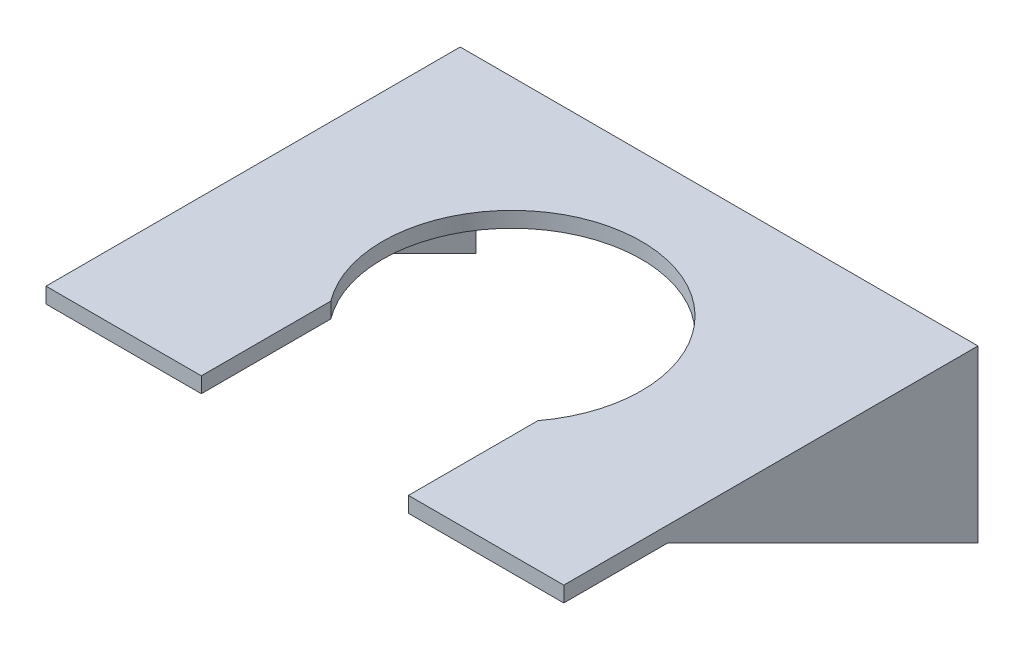
ISO-10303-21;
HEADER;
FILE_DESCRIPTION(('STEP AP214'),'2;1');
FILE_NAME('part.step','',(''),(''),'','','');
FILE_SCHEMA(('AUTOMOTIVE_DESIGN { 1 0 10303 214 1 1 1 1 }'));
ENDSEC;
DATA;
#1=APPLICATION_CONTEXT('core data for automotive mechanical design processes');
#2=APPLICATION_PROTOCOL_DEFINITION('international standard','automotive_design',2000,#1);
#3=PRODUCT_CONTEXT('',#1,'mechanical');
#4=PRODUCT('Part','Part','',(#3));
#5=PRODUCT_RELATED_PRODUCT_CATEGORY('part','',(#4));
#6=PRODUCT_DEFINITION_FORMATION('','',#4);
#7=PRODUCT_DEFINITION_CONTEXT('part definition',#1,'design');
#8=PRODUCT_DEFINITION('design','',#6,#7);
#9=PRODUCT_DEFINITION_SHAPE('','',#8);
#10=(LENGTH_UNIT() NAMED_UNIT(*) SI_UNIT(.MILLI.,.METRE.));
#11=(NAMED_UNIT(*) PLANE_ANGLE_UNIT() SI_UNIT($,.RADIAN.));
#12=(NAMED_UNIT(*) SI_UNIT($,.STERADIAN.) SOLID_ANGLE_UNIT());
#13=UNCERTAINTY_MEASURE_WITH_UNIT(LENGTH_MEASURE(1.E-05),#10,'distance_accuracy_value','');
#14=(GEOMETRIC_REPRESENTATION_CONTEXT(3) GLOBAL_UNCERTAINTY_ASSIGNED_CONTEXT((#13)) GLOBAL_UNIT_ASSIGNED_CONTEXT((#10,
#11,#12)) REPRESENTATION_CONTEXT('',''));
#15=CARTESIAN_POINT('',(0.,0.,0.));
#16=DIRECTION('',(0.,0.,1.));
#17=DIRECTION('',(1.,0.,0.));
#18=AXIS2_PLACEMENT_3D('',#15,#16,#17);
#19=CARTESIAN_POINT('',(-25.,-2.56176848089127,40.));
#20=DIRECTION('',(0.,1.,0.));
#21=DIRECTION('',(-1.,0.,0.));
#22=AXIS2_PLACEMENT_3D('',#19,#20,#21);
#23=PLANE('',#22);
#24=DIRECTION('',(1.,0.,0.));
#25=VECTOR('',#24,1.);
#26=CARTESIAN_POINT('',(23.5,-2.56176848089129,30.));
#27=LINE('',#26,#25);
#28=CARTESIAN_POINT('',(23.5,-2.56176848089126,30.));
#29=VERTEX_POINT('',#28);
#30=CARTESIAN_POINT('',(25.,-2.56176848089126,30.));
#31=VERTEX_POINT('',#30);
#32=EDGE_CURVE('E53',#29,#31,#27,.T.);
#33=ORIENTED_EDGE('',*,*,#32,.T.);
#34=DIRECTION('',(0.,0.,-1.));
#35=VECTOR('',#34,1.);
#36=CARTESIAN_POINT('',(25.,-2.56176848089126,40.));
#37=LINE('',#36,#35);
#38=CARTESIAN_POINT('',(25.,-2.56176848089126,40.));
#39=VERTEX_POINT('',#38);
#40=EDGE_CURVE('E41',#39,#31,#37,.T.);
#41=ORIENTED_EDGE('',*,*,#40,.F.);
#42=DIRECTION('',(1.,0.,0.));
#43=VECTOR('',#42,1.);
#44=CARTESIAN_POINT('',(-25.,-2.56176848089127,40.));
#45=LINE('',#44,#43);
#46=CARTESIAN_POINT('',(10.,-2.56176848089127,40.));
#47=VERTEX_POINT('',#46);
#48=EDGE_CURVE('E190',#47,#39,#45,.T.);
#49=ORIENTED_EDGE('',*,*,#48,.F.);
#50=DIRECTION('',(0.,0.,1.));
#51=VECTOR('',#50,1.);
#52=CARTESIAN_POINT('',(10.,-2.56176848089126,27.5));
#53=LINE('',#52,#51);
#54=CARTESIAN_POINT('',(10.,-2.56176848089126,27.5));
#55=VERTEX_POINT('',#54);
#56=EDGE_CURVE('E164',#55,#47,#53,.T.);
#57=ORIENTED_EDGE('',*,*,#56,.F.);
#58=CARTESIAN_POINT('',(0.,-2.56176848089126,20.));
#59=DIRECTION('',(0.,1.,0.));
#60=DIRECTION('',(-1.,0.,0.));
#61=AXIS2_PLACEMENT_3D('',#58,#59,#60);
#62=CIRCLE('',#61,12.5);
#63=CARTESIAN_POINT('',(-9.99999999999999,-2.56176848089127,27.5));
#64=VERTEX_POINT('',#63);
#65=EDGE_CURVE('E166',#64,#55,#62,.F.);
#66=ORIENTED_EDGE('',*,*,#65,.F.);
#67=DIRECTION('',(0.,0.,-1.));
#68=VECTOR('',#67,1.);
#69=CARTESIAN_POINT('',(-9.99999999999999,-2.56176848089127,27.5));
#70=LINE('',#69,#68);
#71=CARTESIAN_POINT('',(-9.99999999999999,-2.56176848089127,40.));
#72=VERTEX_POINT('',#71);
#73=EDGE_CURVE('E169',#72,#64,#70,.T.);
#74=ORIENTED_EDGE('',*,*,#73,.F.);
#75=CARTESIAN_POINT('',(-25.,-2.56176848089127,40.));
#76=VERTEX_POINT('',#75);
#77=EDGE_CURVE('E192',#76,#72,#45,.T.);
#78=ORIENTED_EDGE('',*,*,#77,.F.);
#79=DIRECTION('',(0.,0.,-1.));
#80=VECTOR('',#79,1.);
#81=CARTESIAN_POINT('',(-25.,-2.56176848089127,40.));
#82=LINE('',#81,#80);
#83=CARTESIAN_POINT('',(-25.,-2.56176848089129,30.));
#84=VERTEX_POINT('',#83);
#85=EDGE_CURVE('E11',#76,#84,#82,.T.);
#86=ORIENTED_EDGE('',*,*,#85,.T.);
#87=DIRECTION('',(-1.,0.,0.));
#88=VECTOR('',#87,1.);
#89=CARTESIAN_POINT('',(-23.5,-2.56176848089129,30.));
#90=LINE('',#89,#88);
#91=CARTESIAN_POINT('',(-23.5,-2.56176848089129,30.));
#92=VERTEX_POINT('',#91);
#93=EDGE_CURVE('E159',#92,#84,#90,.T.);
#94=ORIENTED_EDGE('',*,*,#93,.F.);
#95=DIRECTION('',(0.,0.,-1.));
#96=VECTOR('',#95,1.);
#97=CARTESIAN_POINT('',(-23.5,-2.56176848089129,30.));
#98=LINE('',#97,#96);
#99=CARTESIAN_POINT('',(-23.5,-2.56176848089127,0.));
#100=VERTEX_POINT('',#99);
#101=EDGE_CURVE('E147',#92,#100,#98,.T.);
#102=ORIENTED_EDGE('',*,*,#101,.T.);
#103=DIRECTION('',(1.,0.,0.));
#104=VECTOR('',#103,1.);
#105=CARTESIAN_POINT('',(-25.,-2.56176848089127,0.));
#106=LINE('',#105,#104);
#107=CARTESIAN_POINT('',(23.5,-2.56176848089126,0.));
#108=VERTEX_POINT('',#107);
#109=EDGE_CURVE('E203',#100,#108,#106,.T.);
#110=ORIENTED_EDGE('',*,*,#109,.T.);
#111=DIRECTION('',(0.,0.,-1.));
#112=VECTOR('',#111,1.);
#113=CARTESIAN_POINT('',(23.5,-2.56176848089129,30.));
#114=LINE('',#113,#112);
#115=EDGE_CURVE('E48',#29,#108,#114,.T.);
#116=ORIENTED_EDGE('',*,*,#115,.F.);
#117=EDGE_LOOP('',(#33,#41,#49,#57,#66,#74,#78,#86,#94,#102,#110,#116));
#118=FACE_BOUND('',#117,.T.);
#119=ADVANCED_FACE('F33',(#118),#23,.F.);
#120=CARTESIAN_POINT('',(0.,0.,40.));
#121=DIRECTION('',(0.,0.,1.));
#122=DIRECTION('',(1.,0.,0.));
#123=AXIS2_PLACEMENT_3D('',#120,#121,#122);
#124=PLANE('',#123);
#125=DIRECTION('',(0.,1.,0.));
#126=VECTOR('',#125,1.);
#127=CARTESIAN_POINT('',(10.,-43.5648171480331,40.));
#128=LINE('',#127,#126);
#129=CARTESIAN_POINT('',(10.,-1.06176848089127,40.));
#130=VERTEX_POINT('',#129);
#131=EDGE_CURVE('E179',#47,#130,#128,.T.);
#132=ORIENTED_EDGE('',*,*,#131,.F.);
#133=ORIENTED_EDGE('',*,*,#48,.T.);
#134=DIRECTION('',(0.,1.,0.));
#135=VECTOR('',#134,1.);
#136=CARTESIAN_POINT('',(25.,-1.06176848089126,40.));
#137=LINE('',#136,#135);
#138=CARTESIAN_POINT('',(25.,-1.06176848089126,40.));
#139=VERTEX_POINT('',#138);
#140=EDGE_CURVE('E195',#39,#139,#137,.T.);
#141=ORIENTED_EDGE('',*,*,#140,.T.);
#142=DIRECTION('',(-1.,0.,0.));
#143=VECTOR('',#142,1.);
#144=CARTESIAN_POINT('',(-25.,-1.06176848089127,40.));
#145=LINE('',#144,#143);
#146=EDGE_CURVE('E198',#139,#130,#145,.T.);
#147=ORIENTED_EDGE('',*,*,#146,.T.);
#148=EDGE_LOOP('',(#132,#133,#141,#147));
#149=FACE_BOUND('',#148,.T.);
#150=ADVANCED_FACE('F220',(#149),#124,.T.);
#151=CARTESIAN_POINT('',(-25.,-1.06176848089127,40.));
#152=DIRECTION('',(1.,0.,0.));
#153=DIRECTION('',(0.,0.,-1.));
#154=AXIS2_PLACEMENT_3D('',#151,#152,#153);
#155=PLANE('',#154);
#156=DIRECTION('',(0.,-1.,0.));
#157=VECTOR('',#156,1.);
#158=CARTESIAN_POINT('',(-25.,-1.06176848089127,0.));
#159=LINE('',#158,#157);
#160=CARTESIAN_POINT('',(-25.,-1.06176848089127,0.));
#161=VERTEX_POINT('',#160);
#162=CARTESIAN_POINT('',(-25.,-17.5617684808913,0.));
#163=VERTEX_POINT('',#162);
#164=EDGE_CURVE('E186',#161,#163,#159,.T.);
#165=ORIENTED_EDGE('',*,*,#164,.T.);
#166=DIRECTION('',(0.,0.447213595499958,0.894427190999916));
#167=VECTOR('',#166,1.);
#168=CARTESIAN_POINT('',(-25.,-17.5617684808913,0.));
#169=LINE('',#168,#167);
#170=EDGE_CURVE('E138',#163,#84,#169,.T.);
#171=ORIENTED_EDGE('',*,*,#170,.T.);
#172=ORIENTED_EDGE('',*,*,#85,.F.);
#173=DIRECTION('',(0.,-1.,0.));
#174=VECTOR('',#173,1.);
#175=CARTESIAN_POINT('',(-25.,-1.06176848089127,40.));
#176=LINE('',#175,#174);
#177=CARTESIAN_POINT('',(-25.,-1.06176848089127,40.));
#178=VERTEX_POINT('',#177);
#179=EDGE_CURVE('E187',#178,#76,#176,.T.);
#180=ORIENTED_EDGE('',*,*,#179,.F.);
#181=DIRECTION('',(0.,0.,-1.));
#182=VECTOR('',#181,1.);
#183=CARTESIAN_POINT('',(-25.,-1.06176848089127,40.));
#184=LINE('',#183,#182);
#185=EDGE_CURVE('E201',#178,#161,#184,.T.);
#186=ORIENTED_EDGE('',*,*,#185,.T.);
#187=EDGE_LOOP('',(#165,#171,#172,#180,#186));
#188=FACE_BOUND('',#187,.T.);
#189=ADVANCED_FACE('F35',(#188),#155,.F.);
#190=CARTESIAN_POINT('',(25.,-1.06176848089126,40.));
#191=DIRECTION('',(-1.,0.,0.));
#192=DIRECTION('',(0.,0.,1.));
#193=AXIS2_PLACEMENT_3D('',#190,#191,#192);
#194=PLANE('',#193);
#195=DIRECTION('',(0.,1.,0.));
#196=VECTOR('',#195,1.);
#197=CARTESIAN_POINT('',(25.,-1.06176848089126,0.));
#198=LINE('',#197,#196);
#199=CARTESIAN_POINT('',(25.,-17.5617684808913,0.));
#200=VERTEX_POINT('',#199);
#201=CARTESIAN_POINT('',(25.,-1.06176848089126,0.));
#202=VERTEX_POINT('',#201);
#203=EDGE_CURVE('E134',#200,#202,#198,.T.);
#204=ORIENTED_EDGE('',*,*,#203,.T.);
#205=DIRECTION('',(0.,0.,-1.));
#206=VECTOR('',#205,1.);
#207=CARTESIAN_POINT('',(25.,-1.06176848089126,40.));
#208=LINE('',#207,#206);
#209=EDGE_CURVE('E209',#139,#202,#208,.T.);
#210=ORIENTED_EDGE('',*,*,#209,.F.);
#211=ORIENTED_EDGE('',*,*,#140,.F.);
#212=ORIENTED_EDGE('',*,*,#40,.T.);
#213=DIRECTION('',(0.,0.447213595499958,0.894427190999916));
#214=VECTOR('',#213,1.);
#215=CARTESIAN_POINT('',(25.,-17.5617684808913,0.));
#216=LINE('',#215,#214);
#217=EDGE_CURVE('E142',#200,#31,#216,.T.);
#218=ORIENTED_EDGE('',*,*,#217,.F.);
#219=EDGE_LOOP('',(#204,#210,#211,#212,#218));
#220=FACE_BOUND('',#219,.T.);
#221=ADVANCED_FACE('F213',(#220),#194,.F.);
#222=CARTESIAN_POINT('',(-25.,-1.06176848089127,40.));
#223=DIRECTION('',(0.,-1.,0.));
#224=DIRECTION('',(1.,0.,0.));
#225=AXIS2_PLACEMENT_3D('',#222,#223,#224);
#226=PLANE('',#225);
#227=CARTESIAN_POINT('',(0.,-1.06176848089127,20.));
#228=DIRECTION('',(0.,1.,0.));
#229=DIRECTION('',(0.,0.,1.));
#230=AXIS2_PLACEMENT_3D('',#227,#228,#229);
#231=CIRCLE('',#230,12.5);
#232=CARTESIAN_POINT('',(10.,-1.06176848089127,27.5));
#233=VERTEX_POINT('',#232);
#234=CARTESIAN_POINT('',(-9.99999999999999,-1.06176848089127,27.5));
#235=VERTEX_POINT('',#234);
#236=EDGE_CURVE('E161',#233,#235,#231,.T.);
#237=ORIENTED_EDGE('',*,*,#236,.F.);
#238=DIRECTION('',(0.,0.,-1.));
#239=VECTOR('',#238,1.);
#240=CARTESIAN_POINT('',(10.,-1.06176848089127,27.5));
#241=LINE('',#240,#239);
#242=EDGE_CURVE('E174',#130,#233,#241,.T.);
#243=ORIENTED_EDGE('',*,*,#242,.F.);
#244=ORIENTED_EDGE('',*,*,#146,.F.);
#245=ORIENTED_EDGE('',*,*,#209,.T.);
#246=DIRECTION('',(-1.,0.,0.));
#247=VECTOR('',#246,1.);
#248=CARTESIAN_POINT('',(-25.,-1.06176848089127,0.));
#249=LINE('',#248,#247);
#250=EDGE_CURVE('E191',#202,#161,#249,.T.);
#251=ORIENTED_EDGE('',*,*,#250,.T.);
#252=ORIENTED_EDGE('',*,*,#185,.F.);
#253=CARTESIAN_POINT('',(-9.99999999999999,-1.06176848089127,40.));
#254=VERTEX_POINT('',#253);
#255=EDGE_CURVE('E197',#254,#178,#145,.T.);
#256=ORIENTED_EDGE('',*,*,#255,.F.);
#257=DIRECTION('',(0.,0.,1.));
#258=VECTOR('',#257,1.);
#259=CARTESIAN_POINT('',(-9.99999999999999,-1.06176848089127,27.5));
#260=LINE('',#259,#258);
#261=EDGE_CURVE('E172',#235,#254,#260,.T.);
#262=ORIENTED_EDGE('',*,*,#261,.F.);
#263=EDGE_LOOP('',(#237,#243,#244,#245,#251,#252,#256,#262));
#264=FACE_BOUND('',#263,.T.);
#265=ADVANCED_FACE('F228',(#264),#226,.F.);
#266=DIRECTION('',(0.,1.,0.));
#267=VECTOR('',#266,1.);
#268=CARTESIAN_POINT('',(-9.99999999999999,-43.5648171480331,40.));
#269=LINE('',#268,#267);
#270=EDGE_CURVE('E181',#72,#254,#269,.T.);
#271=ORIENTED_EDGE('',*,*,#270,.T.);
#272=ORIENTED_EDGE('',*,*,#255,.T.);
#273=ORIENTED_EDGE('',*,*,#179,.T.);
#274=ORIENTED_EDGE('',*,*,#77,.T.);
#275=EDGE_LOOP('',(#271,#272,#273,#274));
#276=FACE_BOUND('',#275,.T.);
#277=ADVANCED_FACE('F237',(#276),#124,.T.);
#278=CARTESIAN_POINT('',(0.,0.,0.));
#279=DIRECTION('',(0.,0.,1.));
#280=DIRECTION('',(1.,0.,0.));
#281=AXIS2_PLACEMENT_3D('',#278,#279,#280);
#282=PLANE('',#281);
#283=ORIENTED_EDGE('',*,*,#164,.F.);
#284=ORIENTED_EDGE('',*,*,#250,.F.);
#285=ORIENTED_EDGE('',*,*,#203,.F.);
#286=DIRECTION('',(1.,0.,0.));
#287=VECTOR('',#286,1.);
#288=CARTESIAN_POINT('',(23.5,-17.5617684808913,0.));
#289=LINE('',#288,#287);
#290=CARTESIAN_POINT('',(23.5,-17.5617684808913,0.));
#291=VERTEX_POINT('',#290);
#292=EDGE_CURVE('E130',#291,#200,#289,.T.);
#293=ORIENTED_EDGE('',*,*,#292,.F.);
#294=DIRECTION('',(0.,-1.,0.));
#295=VECTOR('',#294,1.);
#296=CARTESIAN_POINT('',(23.5,-2.56176848089129,0.));
#297=LINE('',#296,#295);
#298=EDGE_CURVE('E121',#108,#291,#297,.T.);
#299=ORIENTED_EDGE('',*,*,#298,.F.);
#300=ORIENTED_EDGE('',*,*,#109,.F.);
#301=DIRECTION('',(0.,-1.,0.));
#302=VECTOR('',#301,1.);
#303=CARTESIAN_POINT('',(-23.5,-2.56176848089129,0.));
#304=LINE('',#303,#302);
#305=CARTESIAN_POINT('',(-23.5,-17.5617684808913,0.));
#306=VERTEX_POINT('',#305);
#307=EDGE_CURVE('E150',#100,#306,#304,.T.);
#308=ORIENTED_EDGE('',*,*,#307,.T.);
#309=DIRECTION('',(-1.,0.,0.));
#310=VECTOR('',#309,1.);
#311=CARTESIAN_POINT('',(-23.5,-17.5617684808913,0.));
#312=LINE('',#311,#310);
#313=EDGE_CURVE('E156',#306,#163,#312,.T.);
#314=ORIENTED_EDGE('',*,*,#313,.T.);
#315=EDGE_LOOP('',(#283,#284,#285,#293,#299,#300,#308,#314));
#316=FACE_BOUND('',#315,.T.);
#317=ADVANCED_FACE('F132',(#316),#282,.F.);
#318=CARTESIAN_POINT('',(0.,-43.5648171480331,20.));
#319=DIRECTION('',(0.,1.,0.));
#320=DIRECTION('',(0.,0.,1.));
#321=AXIS2_PLACEMENT_3D('',#318,#319,#320);
#322=CYLINDRICAL_SURFACE('',#321,12.5);
#323=ORIENTED_EDGE('',*,*,#65,.T.);
#324=DIRECTION('',(0.,1.,0.));
#325=VECTOR('',#324,1.);
#326=CARTESIAN_POINT('',(10.,-43.5648171480331,27.5));
#327=LINE('',#326,#325);
#328=EDGE_CURVE('E167',#55,#233,#327,.T.);
#329=ORIENTED_EDGE('',*,*,#328,.T.);
#330=ORIENTED_EDGE('',*,*,#236,.T.);
#331=DIRECTION('',(0.,1.,0.));
#332=VECTOR('',#331,1.);
#333=CARTESIAN_POINT('',(-9.99999999999999,-43.5648171480331,27.5));
#334=LINE('',#333,#332);
#335=EDGE_CURVE('E177',#64,#235,#334,.T.);
#336=ORIENTED_EDGE('',*,*,#335,.F.);
#337=EDGE_LOOP('',(#323,#329,#330,#336));
#338=FACE_BOUND('',#337,.T.);
#339=ADVANCED_FACE('F233',(#338),#322,.F.);
#340=CARTESIAN_POINT('',(10.,-43.5648171480331,27.5));
#341=DIRECTION('',(1.,0.,0.));
#342=DIRECTION('',(0.,0.,-1.));
#343=AXIS2_PLACEMENT_3D('',#340,#341,#342);
#344=PLANE('',#343);
#345=ORIENTED_EDGE('',*,*,#56,.T.);
#346=ORIENTED_EDGE('',*,*,#131,.T.);
#347=ORIENTED_EDGE('',*,*,#242,.T.);
#348=ORIENTED_EDGE('',*,*,#328,.F.);
#349=EDGE_LOOP('',(#345,#346,#347,#348));
#350=FACE_BOUND('',#349,.T.);
#351=ADVANCED_FACE('F224',(#350),#344,.F.);
#352=CARTESIAN_POINT('',(-9.99999999999999,-43.5648171480331,27.5));
#353=DIRECTION('',(-1.,0.,0.));
#354=DIRECTION('',(0.,0.,1.));
#355=AXIS2_PLACEMENT_3D('',#352,#353,#354);
#356=PLANE('',#355);
#357=ORIENTED_EDGE('',*,*,#73,.T.);
#358=ORIENTED_EDGE('',*,*,#335,.T.);
#359=ORIENTED_EDGE('',*,*,#261,.T.);
#360=ORIENTED_EDGE('',*,*,#270,.F.);
#361=EDGE_LOOP('',(#357,#358,#359,#360));
#362=FACE_BOUND('',#361,.T.);
#363=ADVANCED_FACE('F256',(#362),#356,.F.);
#364=CARTESIAN_POINT('',(-23.5,-17.5617684808913,0.));
#365=DIRECTION('',(0.,-0.894427190999916,0.447213595499958));
#366=DIRECTION('',(0.,-0.447213595499958,-0.894427190999916));
#367=AXIS2_PLACEMENT_3D('',#364,#365,#366);
#368=PLANE('',#367);
#369=ORIENTED_EDGE('',*,*,#170,.F.);
#370=ORIENTED_EDGE('',*,*,#313,.F.);
#371=DIRECTION('',(0.,0.447213595499958,0.894427190999916));
#372=VECTOR('',#371,1.);
#373=CARTESIAN_POINT('',(-23.5,-17.5617684808913,0.));
#374=LINE('',#373,#372);
#375=EDGE_CURVE('E153',#306,#92,#374,.T.);
#376=ORIENTED_EDGE('',*,*,#375,.T.);
#377=ORIENTED_EDGE('',*,*,#93,.T.);
#378=EDGE_LOOP('',(#369,#370,#376,#377));
#379=FACE_BOUND('',#378,.T.);
#380=ADVANCED_FACE('F245',(#379),#368,.T.);
#381=CARTESIAN_POINT('',(-23.5,0.,0.));
#382=DIRECTION('',(-1.,0.,0.));
#383=DIRECTION('',(0.,0.,1.));
#384=AXIS2_PLACEMENT_3D('',#381,#382,#383);
#385=PLANE('',#384);
#386=ORIENTED_EDGE('',*,*,#101,.F.);
#387=ORIENTED_EDGE('',*,*,#375,.F.);
#388=ORIENTED_EDGE('',*,*,#307,.F.);
#389=EDGE_LOOP('',(#386,#387,#388));
#390=FACE_BOUND('',#389,.T.);
#391=ADVANCED_FACE('F248',(#390),#385,.F.);
#392=CARTESIAN_POINT('',(23.5,-17.5617684808913,0.));
#393=DIRECTION('',(0.,0.894427190999916,-0.447213595499958));
#394=DIRECTION('',(0.,0.447213595499958,0.894427190999916));
#395=AXIS2_PLACEMENT_3D('',#392,#393,#394);
#396=PLANE('',#395);
#397=ORIENTED_EDGE('',*,*,#217,.T.);
#398=ORIENTED_EDGE('',*,*,#32,.F.);
#399=DIRECTION('',(0.,0.447213595499958,0.894427190999916));
#400=VECTOR('',#399,1.);
#401=CARTESIAN_POINT('',(23.5,-17.5617684808913,0.));
#402=LINE('',#401,#400);
#403=EDGE_CURVE('E125',#291,#29,#402,.T.);
#404=ORIENTED_EDGE('',*,*,#403,.F.);
#405=ORIENTED_EDGE('',*,*,#292,.T.);
#406=EDGE_LOOP('',(#397,#398,#404,#405));
#407=FACE_BOUND('',#406,.T.);
#408=ADVANCED_FACE('F140',(#407),#396,.F.);
#409=CARTESIAN_POINT('',(23.5,0.,0.));
#410=DIRECTION('',(1.,0.,0.));
#411=DIRECTION('',(0.,0.,1.));
#412=AXIS2_PLACEMENT_3D('',#409,#410,#411);
#413=PLANE('',#412);
#414=ORIENTED_EDGE('',*,*,#115,.T.);
#415=ORIENTED_EDGE('',*,*,#298,.T.);
#416=ORIENTED_EDGE('',*,*,#403,.T.);
#417=EDGE_LOOP('',(#414,#415,#416));
#418=FACE_BOUND('',#417,.T.);
#419=ADVANCED_FACE('F123',(#418),#413,.F.);
#420=CLOSED_SHELL('',(#119,#150,#189,#221,#265,#277,#317,#339,#351,#363,#380,#391,#408,#419));
#421=MANIFOLD_SOLID_BREP('B2',#420);
#422=ADVANCED_BREP_SHAPE_REPRESENTATION('',(#18,#421),#14);
#423=SHAPE_DEFINITION_REPRESENTATION(#9,#422);
ENDSEC;
END-ISO-10303-21;
